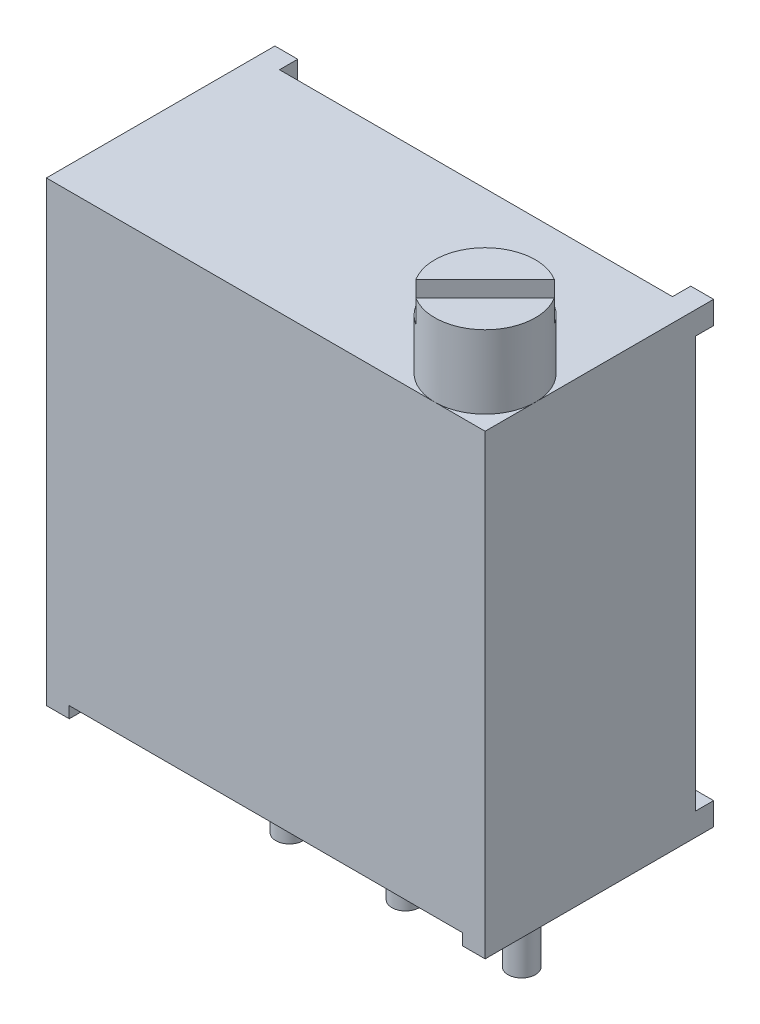
ISO-10303-21;
HEADER;
FILE_DESCRIPTION(('STEP AP214'),'2;1');
FILE_NAME('part.step','',(''),(''),'','','');
FILE_SCHEMA(('AUTOMOTIVE_DESIGN { 1 0 10303 214 1 1 1 1 }'));
ENDSEC;
DATA;
#1=APPLICATION_CONTEXT('core data for automotive mechanical design processes');
#2=APPLICATION_PROTOCOL_DEFINITION('international standard','automotive_design',2000,#1);
#3=PRODUCT_CONTEXT('',#1,'mechanical');
#4=PRODUCT('Part','Part','',(#3));
#5=PRODUCT_RELATED_PRODUCT_CATEGORY('part','',(#4));
#6=PRODUCT_DEFINITION_FORMATION('','',#4);
#7=PRODUCT_DEFINITION_CONTEXT('part definition',#1,'design');
#8=PRODUCT_DEFINITION('design','',#6,#7);
#9=PRODUCT_DEFINITION_SHAPE('','',#8);
#10=(LENGTH_UNIT() NAMED_UNIT(*) SI_UNIT(.MILLI.,.METRE.));
#11=(NAMED_UNIT(*) PLANE_ANGLE_UNIT() SI_UNIT($,.RADIAN.));
#12=(NAMED_UNIT(*) SI_UNIT($,.STERADIAN.) SOLID_ANGLE_UNIT());
#13=UNCERTAINTY_MEASURE_WITH_UNIT(LENGTH_MEASURE(1.E-05),#10,'distance_accuracy_value','');
#14=(GEOMETRIC_REPRESENTATION_CONTEXT(3) GLOBAL_UNCERTAINTY_ASSIGNED_CONTEXT((#13)) GLOBAL_UNIT_ASSIGNED_CONTEXT((#10,
#11,#12)) REPRESENTATION_CONTEXT('',''));
#15=CARTESIAN_POINT('',(0.,0.,0.));
#16=DIRECTION('',(0.,0.,1.));
#17=DIRECTION('',(1.,0.,0.));
#18=AXIS2_PLACEMENT_3D('',#15,#16,#17);
#19=CARTESIAN_POINT('',(1.1,11.6,1.9));
#20=DIRECTION('',(0.,1.,0.));
#21=DIRECTION('',(0.,0.,1.));
#22=AXIS2_PLACEMENT_3D('',#19,#20,#21);
#23=PLANE('',#22);
#24=DIRECTION('',(-0.707106781186547,0.,0.707106781186548));
#25=VECTOR('',#24,1.);
#26=CARTESIAN_POINT('',(0.165760434326207,11.6,2.48068617508052));
#27=LINE('',#26,#25);
#28=CARTESIAN_POINT('',(1.68068617508052,11.6,0.965760434326207));
#29=VERTEX_POINT('',#28);
#30=CARTESIAN_POINT('',(0.165760434326207,11.6,2.48068617508052));
#31=VERTEX_POINT('',#30);
#32=EDGE_CURVE('E89',#29,#31,#27,.T.);
#33=ORIENTED_EDGE('',*,*,#32,.F.);
#34=CARTESIAN_POINT('',(1.1,11.6,1.9));
#35=DIRECTION('',(0.,1.,0.));
#36=DIRECTION('',(0.,0.,1.));
#37=AXIS2_PLACEMENT_3D('',#34,#35,#36);
#38=CIRCLE('',#37,1.1);
#39=EDGE_CURVE('E13',#29,#31,#38,.T.);
#40=ORIENTED_EDGE('',*,*,#39,.T.);
#41=EDGE_LOOP('',(#33,#40));
#42=FACE_BOUND('',#41,.T.);
#43=ADVANCED_FACE('F50',(#42),#23,.T.);
#44=CARTESIAN_POINT('',(1.1,11.6,1.9));
#45=DIRECTION('',(0.,-1.,0.));
#46=DIRECTION('',(0.,0.,-1.));
#47=AXIS2_PLACEMENT_3D('',#44,#45,#46);
#48=CYLINDRICAL_SURFACE('',#47,1.1);
#49=ORIENTED_EDGE('',*,*,#39,.F.);
#50=DIRECTION('',(0.,1.,0.));
#51=VECTOR('',#50,1.);
#52=CARTESIAN_POINT('',(1.68068617508052,11.1,0.965760434326207));
#53=LINE('',#52,#51);
#54=CARTESIAN_POINT('',(1.68068617508052,11.1,0.965760434326207));
#55=VERTEX_POINT('',#54);
#56=EDGE_CURVE('E103',#55,#29,#53,.T.);
#57=ORIENTED_EDGE('',*,*,#56,.F.);
#58=CARTESIAN_POINT('',(1.1,11.1,1.9));
#59=DIRECTION('',(0.,1.,0.));
#60=DIRECTION('',(0.,0.,1.));
#61=AXIS2_PLACEMENT_3D('',#58,#59,#60);
#62=CIRCLE('',#61,1.1);
#63=CARTESIAN_POINT('',(2.03423956567379,11.1,1.31931382491948));
#64=VERTEX_POINT('',#63);
#65=EDGE_CURVE('E107',#64,#55,#62,.T.);
#66=ORIENTED_EDGE('',*,*,#65,.F.);
#67=DIRECTION('',(0.,1.,0.));
#68=VECTOR('',#67,1.);
#69=CARTESIAN_POINT('',(2.03423956567379,11.1,1.31931382491948));
#70=LINE('',#69,#68);
#71=CARTESIAN_POINT('',(2.03423956567379,11.6,1.31931382491948));
#72=VERTEX_POINT('',#71);
#73=EDGE_CURVE('E96',#64,#72,#70,.T.);
#74=ORIENTED_EDGE('',*,*,#73,.T.);
#75=CARTESIAN_POINT('',(0.519313824919481,11.6,2.83423956567379));
#76=VERTEX_POINT('',#75);
#77=EDGE_CURVE('E59',#76,#72,#38,.T.);
#78=ORIENTED_EDGE('',*,*,#77,.F.);
#79=DIRECTION('',(0.,1.,0.));
#80=VECTOR('',#79,1.);
#81=CARTESIAN_POINT('',(0.519313824919481,11.1,2.83423956567379));
#82=LINE('',#81,#80);
#83=CARTESIAN_POINT('',(0.519313824919481,11.1,2.83423956567379));
#84=VERTEX_POINT('',#83);
#85=EDGE_CURVE('E66',#84,#76,#82,.T.);
#86=ORIENTED_EDGE('',*,*,#85,.F.);
#87=CARTESIAN_POINT('',(1.1,11.1,1.9));
#88=DIRECTION('',(0.,1.,0.));
#89=DIRECTION('',(0.,0.,1.));
#90=AXIS2_PLACEMENT_3D('',#87,#88,#89);
#91=CIRCLE('',#90,1.1);
#92=CARTESIAN_POINT('',(0.165760434326207,11.1,2.48068617508052));
#93=VERTEX_POINT('',#92);
#94=EDGE_CURVE('E109',#93,#84,#91,.T.);
#95=ORIENTED_EDGE('',*,*,#94,.F.);
#96=DIRECTION('',(0.,1.,0.));
#97=VECTOR('',#96,1.);
#98=CARTESIAN_POINT('',(0.165760434326207,11.1,2.48068617508052));
#99=LINE('',#98,#97);
#100=EDGE_CURVE('E75',#93,#31,#99,.T.);
#101=ORIENTED_EDGE('',*,*,#100,.T.);
#102=EDGE_LOOP('',(#49,#57,#66,#74,#78,#86,#95,#101));
#103=FACE_BOUND('',#102,.T.);
#104=CARTESIAN_POINT('',(1.1,10.,1.9));
#105=DIRECTION('',(0.,1.,0.));
#106=DIRECTION('',(0.,0.,1.));
#107=AXIS2_PLACEMENT_3D('',#104,#105,#106);
#108=CIRCLE('',#107,1.1);
#109=CARTESIAN_POINT('',(1.1,10.,3.));
#110=VERTEX_POINT('',#109);
#111=EDGE_CURVE('E54',#110,#110,#108,.T.);
#112=ORIENTED_EDGE('',*,*,#111,.T.);
#113=EDGE_LOOP('',(#112));
#114=FACE_BOUND('',#113,.T.);
#115=ADVANCED_FACE('F52',(#103,#114),#48,.T.);
#116=DIRECTION('',(0.707106781186547,0.,-0.707106781186548));
#117=VECTOR('',#116,1.);
#118=CARTESIAN_POINT('',(2.03423956567379,11.6,1.31931382491948));
#119=LINE('',#118,#117);
#120=EDGE_CURVE('E98',#76,#72,#119,.T.);
#121=ORIENTED_EDGE('',*,*,#120,.F.);
#122=ORIENTED_EDGE('',*,*,#77,.T.);
#123=EDGE_LOOP('',(#121,#122));
#124=FACE_BOUND('',#123,.T.);
#125=ADVANCED_FACE('F130',(#124),#23,.T.);
#126=CARTESIAN_POINT('',(1.1,10.,1.9));
#127=DIRECTION('',(0.,1.,0.));
#128=DIRECTION('',(0.,0.,1.));
#129=AXIS2_PLACEMENT_3D('',#126,#127,#128);
#130=PLANE('',#129);
#131=ORIENTED_EDGE('',*,*,#111,.F.);
#132=EDGE_LOOP('',(#131));
#133=FACE_BOUND('',#132,.T.);
#134=ADVANCED_FACE('F127',(#133),#130,.F.);
#135=CARTESIAN_POINT('',(0.165760434326207,11.1,2.48068617508052));
#136=DIRECTION('',(-0.707106781186548,0.,-0.707106781186547));
#137=DIRECTION('',(-0.707106781186547,0.,0.707106781186548));
#138=AXIS2_PLACEMENT_3D('',#135,#136,#137);
#139=PLANE('',#138);
#140=ORIENTED_EDGE('',*,*,#32,.T.);
#141=ORIENTED_EDGE('',*,*,#100,.F.);
#142=DIRECTION('',(-0.707106781186547,0.,0.707106781186548));
#143=VECTOR('',#142,1.);
#144=CARTESIAN_POINT('',(0.165760434326207,11.1,2.48068617508052));
#145=LINE('',#144,#143);
#146=EDGE_CURVE('E114',#55,#93,#145,.T.);
#147=ORIENTED_EDGE('',*,*,#146,.F.);
#148=ORIENTED_EDGE('',*,*,#56,.T.);
#149=EDGE_LOOP('',(#140,#141,#147,#148));
#150=FACE_BOUND('',#149,.T.);
#151=ADVANCED_FACE('F129',(#150),#139,.F.);
#152=CARTESIAN_POINT('',(2.03423956567379,11.1,1.31931382491948));
#153=DIRECTION('',(0.707106781186548,0.,0.707106781186547));
#154=DIRECTION('',(0.707106781186547,0.,-0.707106781186548));
#155=AXIS2_PLACEMENT_3D('',#152,#153,#154);
#156=PLANE('',#155);
#157=ORIENTED_EDGE('',*,*,#120,.T.);
#158=ORIENTED_EDGE('',*,*,#73,.F.);
#159=DIRECTION('',(0.707106781186547,0.,-0.707106781186548));
#160=VECTOR('',#159,1.);
#161=CARTESIAN_POINT('',(2.03423956567379,11.1,1.31931382491948));
#162=LINE('',#161,#160);
#163=EDGE_CURVE('E93',#84,#64,#162,.T.);
#164=ORIENTED_EDGE('',*,*,#163,.F.);
#165=ORIENTED_EDGE('',*,*,#85,.T.);
#166=EDGE_LOOP('',(#157,#158,#164,#165));
#167=FACE_BOUND('',#166,.T.);
#168=ADVANCED_FACE('F97',(#167),#156,.F.);
#169=CARTESIAN_POINT('',(1.1,11.1,1.9));
#170=DIRECTION('',(0.,1.,0.));
#171=DIRECTION('',(0.,0.,1.));
#172=AXIS2_PLACEMENT_3D('',#169,#170,#171);
#173=PLANE('',#172);
#174=ORIENTED_EDGE('',*,*,#94,.T.);
#175=ORIENTED_EDGE('',*,*,#163,.T.);
#176=ORIENTED_EDGE('',*,*,#65,.T.);
#177=ORIENTED_EDGE('',*,*,#146,.T.);
#178=EDGE_LOOP('',(#174,#175,#176,#177));
#179=FACE_BOUND('',#178,.T.);
#180=ADVANCED_FACE('F106',(#179),#173,.T.);
#181=CLOSED_SHELL('',(#43,#115,#125,#134,#151,#168,#180));
#182=MANIFOLD_SOLID_BREP('B2',#181);
#183=CARTESIAN_POINT('',(-6.9,0.25,3.));
#184=DIRECTION('',(0.,1.,0.));
#185=DIRECTION('',(0.,0.,1.));
#186=AXIS2_PLACEMENT_3D('',#183,#184,#185);
#187=PLANE('',#186);
#188=CARTESIAN_POINT('',(-2.54,0.25,0.));
#189=DIRECTION('',(0.,1.,0.));
#190=DIRECTION('',(0.,0.,1.));
#191=AXIS2_PLACEMENT_3D('',#188,#189,#190);
#192=CIRCLE('',#191,0.3);
#193=CARTESIAN_POINT('',(-2.54,0.25,0.3));
#194=VERTEX_POINT('',#193);
#195=EDGE_CURVE('E196',#194,#194,#192,.F.);
#196=ORIENTED_EDGE('',*,*,#195,.F.);
#197=EDGE_LOOP('',(#196));
#198=FACE_BOUND('',#197,.T.);
#199=DIRECTION('',(0.,0.,-1.));
#200=VECTOR('',#199,1.);
#201=CARTESIAN_POINT('',(-6.9,0.25,-1.6));
#202=LINE('',#201,#200);
#203=CARTESIAN_POINT('',(-6.9,0.25,3.));
#204=VERTEX_POINT('',#203);
#205=CARTESIAN_POINT('',(-6.9,0.25,-1.6));
#206=VERTEX_POINT('',#205);
#207=EDGE_CURVE('E322',#204,#206,#202,.T.);
#208=ORIENTED_EDGE('',*,*,#207,.T.);
#209=DIRECTION('',(1.,0.,0.));
#210=VECTOR('',#209,1.);
#211=CARTESIAN_POINT('',(-6.9,0.25,-1.6));
#212=LINE('',#211,#210);
#213=CARTESIAN_POINT('',(1.7,0.25,-1.6));
#214=VERTEX_POINT('',#213);
#215=EDGE_CURVE('E326',#206,#214,#212,.T.);
#216=ORIENTED_EDGE('',*,*,#215,.T.);
#217=DIRECTION('',(0.,0.,1.));
#218=VECTOR('',#217,1.);
#219=CARTESIAN_POINT('',(1.7,0.25,-1.6));
#220=LINE('',#219,#218);
#221=CARTESIAN_POINT('',(1.7,0.25,3.));
#222=VERTEX_POINT('',#221);
#223=EDGE_CURVE('E343',#214,#222,#220,.T.);
#224=ORIENTED_EDGE('',*,*,#223,.T.);
#225=DIRECTION('',(-1.,0.,0.));
#226=VECTOR('',#225,1.);
#227=CARTESIAN_POINT('',(-6.9,0.25,3.));
#228=LINE('',#227,#226);
#229=EDGE_CURVE('E329',#222,#204,#228,.T.);
#230=ORIENTED_EDGE('',*,*,#229,.T.);
#231=EDGE_LOOP('',(#208,#216,#224,#230));
#232=FACE_BOUND('',#231,.T.);
#233=CARTESIAN_POINT('',(0.,0.25,0.));
#234=DIRECTION('',(0.,1.,0.));
#235=DIRECTION('',(0.,0.,1.));
#236=AXIS2_PLACEMENT_3D('',#233,#234,#235);
#237=CIRCLE('',#236,0.3);
#238=CARTESIAN_POINT('',(0.,0.25,0.3));
#239=VERTEX_POINT('',#238);
#240=EDGE_CURVE('E457',#239,#239,#237,.F.);
#241=ORIENTED_EDGE('',*,*,#240,.F.);
#242=EDGE_LOOP('',(#241));
#243=FACE_BOUND('',#242,.T.);
#244=CARTESIAN_POINT('',(-5.08,0.25,0.));
#245=DIRECTION('',(0.,1.,0.));
#246=DIRECTION('',(0.,0.,1.));
#247=AXIS2_PLACEMENT_3D('',#244,#245,#246);
#248=CIRCLE('',#247,0.3);
#249=CARTESIAN_POINT('',(-5.08,0.25,0.299999999999999));
#250=VERTEX_POINT('',#249);
#251=EDGE_CURVE('E48',#250,#250,#248,.F.);
#252=ORIENTED_EDGE('',*,*,#251,.F.);
#253=EDGE_LOOP('',(#252));
#254=FACE_BOUND('',#253,.T.);
#255=ADVANCED_FACE('F187',(#198,#232,#243,#254),#187,.F.);
#256=CARTESIAN_POINT('',(2.2,0.,3.));
#257=DIRECTION('',(0.,-1.,0.));
#258=DIRECTION('',(0.,0.,-1.));
#259=AXIS2_PLACEMENT_3D('',#256,#257,#258);
#260=PLANE('',#259);
#261=DIRECTION('',(0.,0.,-1.));
#262=VECTOR('',#261,1.);
#263=CARTESIAN_POINT('',(-6.9,0.,-1.6));
#264=LINE('',#263,#262);
#265=CARTESIAN_POINT('',(-6.9,0.,3.));
#266=VERTEX_POINT('',#265);
#267=CARTESIAN_POINT('',(-6.9,0.,-2.));
#268=VERTEX_POINT('',#267);
#269=EDGE_CURVE('E364',#266,#268,#264,.T.);
#270=ORIENTED_EDGE('',*,*,#269,.F.);
#271=DIRECTION('',(1.,0.,0.));
#272=VECTOR('',#271,1.);
#273=CARTESIAN_POINT('',(2.2,0.,3.));
#274=LINE('',#273,#272);
#275=CARTESIAN_POINT('',(-7.4,0.,3.));
#276=VERTEX_POINT('',#275);
#277=EDGE_CURVE('E431',#276,#266,#274,.T.);
#278=ORIENTED_EDGE('',*,*,#277,.F.);
#279=DIRECTION('',(0.,0.,1.));
#280=VECTOR('',#279,1.);
#281=CARTESIAN_POINT('',(-7.4,0.,-2.));
#282=LINE('',#281,#280);
#283=CARTESIAN_POINT('',(-7.4,0.,-2.));
#284=VERTEX_POINT('',#283);
#285=EDGE_CURVE('E221',#284,#276,#282,.T.);
#286=ORIENTED_EDGE('',*,*,#285,.F.);
#287=DIRECTION('',(-1.,0.,0.));
#288=VECTOR('',#287,1.);
#289=CARTESIAN_POINT('',(2.2,0.,-2.));
#290=LINE('',#289,#288);
#291=EDGE_CURVE('E439',#268,#284,#290,.T.);
#292=ORIENTED_EDGE('',*,*,#291,.F.);
#293=EDGE_LOOP('',(#270,#278,#286,#292));
#294=FACE_BOUND('',#293,.T.);
#295=ADVANCED_FACE('F465',(#294),#260,.T.);
#296=CARTESIAN_POINT('',(2.2,10.,-2.));
#297=DIRECTION('',(0.,0.,1.));
#298=DIRECTION('',(1.,0.,0.));
#299=AXIS2_PLACEMENT_3D('',#296,#297,#298);
#300=PLANE('',#299);
#301=DIRECTION('',(-1.,0.,0.));
#302=VECTOR('',#301,1.);
#303=CARTESIAN_POINT('',(-7.4,9.5,-2.));
#304=LINE('',#303,#302);
#305=CARTESIAN_POINT('',(-6.9,9.5,-2.));
#306=VERTEX_POINT('',#305);
#307=CARTESIAN_POINT('',(-7.4,9.5,-2.));
#308=VERTEX_POINT('',#307);
#309=EDGE_CURVE('E408',#306,#308,#304,.T.);
#310=ORIENTED_EDGE('',*,*,#309,.T.);
#311=DIRECTION('',(0.,-1.,0.));
#312=VECTOR('',#311,1.);
#313=CARTESIAN_POINT('',(-7.4,10.,-2.));
#314=LINE('',#313,#312);
#315=CARTESIAN_POINT('',(-7.4,10.,-2.));
#316=VERTEX_POINT('',#315);
#317=EDGE_CURVE('E450',#316,#308,#314,.T.);
#318=ORIENTED_EDGE('',*,*,#317,.F.);
#319=DIRECTION('',(-1.,0.,0.));
#320=VECTOR('',#319,1.);
#321=CARTESIAN_POINT('',(2.2,10.,-2.));
#322=LINE('',#321,#320);
#323=CARTESIAN_POINT('',(-6.9,10.,-2.));
#324=VERTEX_POINT('',#323);
#325=EDGE_CURVE('E430',#324,#316,#322,.T.);
#326=ORIENTED_EDGE('',*,*,#325,.F.);
#327=DIRECTION('',(0.,-1.,0.));
#328=VECTOR('',#327,1.);
#329=CARTESIAN_POINT('',(-6.9,10.,-2.));
#330=LINE('',#329,#328);
#331=EDGE_CURVE('E399',#324,#306,#330,.T.);
#332=ORIENTED_EDGE('',*,*,#331,.T.);
#333=EDGE_LOOP('',(#310,#318,#326,#332));
#334=FACE_BOUND('',#333,.T.);
#335=ADVANCED_FACE('F470',(#334),#300,.F.);
#336=DIRECTION('',(0.,1.,0.));
#337=VECTOR('',#336,1.);
#338=CARTESIAN_POINT('',(1.7,10.,-2.));
#339=LINE('',#338,#337);
#340=CARTESIAN_POINT('',(1.7,9.5,-2.));
#341=VERTEX_POINT('',#340);
#342=CARTESIAN_POINT('',(1.7,10.,-2.));
#343=VERTEX_POINT('',#342);
#344=EDGE_CURVE('E389',#341,#343,#339,.T.);
#345=ORIENTED_EDGE('',*,*,#344,.T.);
#346=CARTESIAN_POINT('',(2.2,10.,-2.));
#347=VERTEX_POINT('',#346);
#348=EDGE_CURVE('E432',#347,#343,#322,.T.);
#349=ORIENTED_EDGE('',*,*,#348,.F.);
#350=DIRECTION('',(0.,-1.,0.));
#351=VECTOR('',#350,1.);
#352=CARTESIAN_POINT('',(2.2,10.,-2.));
#353=LINE('',#352,#351);
#354=CARTESIAN_POINT('',(2.2,9.5,-2.));
#355=VERTEX_POINT('',#354);
#356=EDGE_CURVE('E454',#347,#355,#353,.T.);
#357=ORIENTED_EDGE('',*,*,#356,.T.);
#358=DIRECTION('',(-1.,0.,0.));
#359=VECTOR('',#358,1.);
#360=CARTESIAN_POINT('',(2.2,9.5,-2.));
#361=LINE('',#360,#359);
#362=EDGE_CURVE('E380',#355,#341,#361,.T.);
#363=ORIENTED_EDGE('',*,*,#362,.T.);
#364=EDGE_LOOP('',(#345,#349,#357,#363));
#365=FACE_BOUND('',#364,.T.);
#366=ADVANCED_FACE('F522',(#365),#300,.F.);
#367=DIRECTION('',(1.,0.,0.));
#368=VECTOR('',#367,1.);
#369=CARTESIAN_POINT('',(2.2,0.499999999999999,-2.));
#370=LINE('',#369,#368);
#371=CARTESIAN_POINT('',(1.7,0.499999999999999,-2.));
#372=VERTEX_POINT('',#371);
#373=CARTESIAN_POINT('',(2.2,0.499999999999999,-2.));
#374=VERTEX_POINT('',#373);
#375=EDGE_CURVE('E370',#372,#374,#370,.T.);
#376=ORIENTED_EDGE('',*,*,#375,.T.);
#377=CARTESIAN_POINT('',(2.2,0.,-2.));
#378=VERTEX_POINT('',#377);
#379=EDGE_CURVE('E453',#374,#378,#353,.T.);
#380=ORIENTED_EDGE('',*,*,#379,.T.);
#381=CARTESIAN_POINT('',(1.7,0.,-2.));
#382=VERTEX_POINT('',#381);
#383=EDGE_CURVE('E440',#378,#382,#290,.T.);
#384=ORIENTED_EDGE('',*,*,#383,.T.);
#385=DIRECTION('',(0.,1.,0.));
#386=VECTOR('',#385,1.);
#387=CARTESIAN_POINT('',(1.7,0.,-2.));
#388=LINE('',#387,#386);
#389=EDGE_CURVE('E366',#382,#372,#388,.T.);
#390=ORIENTED_EDGE('',*,*,#389,.T.);
#391=EDGE_LOOP('',(#376,#380,#384,#390));
#392=FACE_BOUND('',#391,.T.);
#393=ADVANCED_FACE('F527',(#392),#300,.F.);
#394=DIRECTION('',(0.,-1.,0.));
#395=VECTOR('',#394,1.);
#396=CARTESIAN_POINT('',(-6.9,0.,-2.));
#397=LINE('',#396,#395);
#398=CARTESIAN_POINT('',(-6.9,0.499999999999999,-2.));
#399=VERTEX_POINT('',#398);
#400=EDGE_CURVE('E354',#399,#268,#397,.T.);
#401=ORIENTED_EDGE('',*,*,#400,.T.);
#402=ORIENTED_EDGE('',*,*,#291,.T.);
#403=CARTESIAN_POINT('',(-7.4,0.499999999999999,-2.));
#404=VERTEX_POINT('',#403);
#405=EDGE_CURVE('E449',#404,#284,#314,.T.);
#406=ORIENTED_EDGE('',*,*,#405,.F.);
#407=DIRECTION('',(1.,0.,0.));
#408=VECTOR('',#407,1.);
#409=CARTESIAN_POINT('',(-7.4,0.499999999999999,-2.));
#410=LINE('',#409,#408);
#411=EDGE_CURVE('E358',#404,#399,#410,.T.);
#412=ORIENTED_EDGE('',*,*,#411,.T.);
#413=EDGE_LOOP('',(#401,#402,#406,#412));
#414=FACE_BOUND('',#413,.T.);
#415=ADVANCED_FACE('F520',(#414),#300,.F.);
#416=CARTESIAN_POINT('',(-7.4,10.,-2.));
#417=DIRECTION('',(1.,0.,0.));
#418=DIRECTION('',(0.,0.,-1.));
#419=AXIS2_PLACEMENT_3D('',#416,#417,#418);
#420=PLANE('',#419);
#421=DIRECTION('',(0.,0.,-1.));
#422=VECTOR('',#421,1.);
#423=CARTESIAN_POINT('',(-7.4,9.5,-1.6));
#424=LINE('',#423,#422);
#425=CARTESIAN_POINT('',(-7.4,9.5,-1.6));
#426=VERTEX_POINT('',#425);
#427=EDGE_CURVE('E416',#426,#308,#424,.T.);
#428=ORIENTED_EDGE('',*,*,#427,.F.);
#429=DIRECTION('',(0.,1.,0.));
#430=VECTOR('',#429,1.);
#431=CARTESIAN_POINT('',(-7.4,10.,-1.6));
#432=LINE('',#431,#430);
#433=CARTESIAN_POINT('',(-7.4,0.499999999999999,-1.6));
#434=VERTEX_POINT('',#433);
#435=EDGE_CURVE('E424',#434,#426,#432,.T.);
#436=ORIENTED_EDGE('',*,*,#435,.F.);
#437=DIRECTION('',(0.,0.,-1.));
#438=VECTOR('',#437,1.);
#439=CARTESIAN_POINT('',(-7.4,0.499999999999999,-1.6));
#440=LINE('',#439,#438);
#441=EDGE_CURVE('E349',#434,#404,#440,.T.);
#442=ORIENTED_EDGE('',*,*,#441,.T.);
#443=ORIENTED_EDGE('',*,*,#405,.T.);
#444=ORIENTED_EDGE('',*,*,#285,.T.);
#445=DIRECTION('',(0.,-1.,0.));
#446=VECTOR('',#445,1.);
#447=CARTESIAN_POINT('',(-7.4,10.,3.));
#448=LINE('',#447,#446);
#449=CARTESIAN_POINT('',(-7.4,10.,3.));
#450=VERTEX_POINT('',#449);
#451=EDGE_CURVE('E447',#450,#276,#448,.T.);
#452=ORIENTED_EDGE('',*,*,#451,.F.);
#453=DIRECTION('',(0.,0.,1.));
#454=VECTOR('',#453,1.);
#455=CARTESIAN_POINT('',(-7.4,10.,-2.));
#456=LINE('',#455,#454);
#457=EDGE_CURVE('E434',#316,#450,#456,.T.);
#458=ORIENTED_EDGE('',*,*,#457,.F.);
#459=ORIENTED_EDGE('',*,*,#317,.T.);
#460=EDGE_LOOP('',(#428,#436,#442,#443,#444,#452,#458,#459));
#461=FACE_BOUND('',#460,.T.);
#462=ADVANCED_FACE('F515',(#461),#420,.F.);
#463=CARTESIAN_POINT('',(1.7,0.,3.));
#464=VERTEX_POINT('',#463);
#465=CARTESIAN_POINT('',(2.2,0.,3.));
#466=VERTEX_POINT('',#465);
#467=EDGE_CURVE('E228',#464,#466,#274,.T.);
#468=ORIENTED_EDGE('',*,*,#467,.F.);
#469=DIRECTION('',(0.,0.,-1.));
#470=VECTOR('',#469,1.);
#471=CARTESIAN_POINT('',(1.7,0.,-1.6));
#472=LINE('',#471,#470);
#473=EDGE_CURVE('E373',#464,#382,#472,.T.);
#474=ORIENTED_EDGE('',*,*,#473,.T.);
#475=ORIENTED_EDGE('',*,*,#383,.F.);
#476=DIRECTION('',(0.,0.,-1.));
#477=VECTOR('',#476,1.);
#478=CARTESIAN_POINT('',(2.2,0.,-2.));
#479=LINE('',#478,#477);
#480=EDGE_CURVE('E428',#466,#378,#479,.T.);
#481=ORIENTED_EDGE('',*,*,#480,.F.);
#482=EDGE_LOOP('',(#468,#474,#475,#481));
#483=FACE_BOUND('',#482,.T.);
#484=ADVANCED_FACE('F473',(#483),#260,.T.);
#485=CARTESIAN_POINT('',(2.2,10.,-2.));
#486=DIRECTION('',(-1.,0.,0.));
#487=DIRECTION('',(0.,0.,1.));
#488=AXIS2_PLACEMENT_3D('',#485,#486,#487);
#489=PLANE('',#488);
#490=DIRECTION('',(0.,0.,-1.));
#491=VECTOR('',#490,1.);
#492=CARTESIAN_POINT('',(2.2,0.499999999999999,-1.6));
#493=LINE('',#492,#491);
#494=CARTESIAN_POINT('',(2.2,0.499999999999999,-1.6));
#495=VERTEX_POINT('',#494);
#496=EDGE_CURVE('E378',#495,#374,#493,.T.);
#497=ORIENTED_EDGE('',*,*,#496,.F.);
#498=DIRECTION('',(0.,-1.,0.));
#499=VECTOR('',#498,1.);
#500=CARTESIAN_POINT('',(2.2,10.,-1.6));
#501=LINE('',#500,#499);
#502=CARTESIAN_POINT('',(2.2,9.5,-1.6));
#503=VERTEX_POINT('',#502);
#504=EDGE_CURVE('E426',#503,#495,#501,.T.);
#505=ORIENTED_EDGE('',*,*,#504,.F.);
#506=DIRECTION('',(0.,0.,-1.));
#507=VECTOR('',#506,1.);
#508=CARTESIAN_POINT('',(2.2,9.5,-1.6));
#509=LINE('',#508,#507);
#510=EDGE_CURVE('E392',#503,#355,#509,.T.);
#511=ORIENTED_EDGE('',*,*,#510,.T.);
#512=ORIENTED_EDGE('',*,*,#356,.F.);
#513=DIRECTION('',(0.,0.,-1.));
#514=VECTOR('',#513,1.);
#515=CARTESIAN_POINT('',(2.2,10.,-2.));
#516=LINE('',#515,#514);
#517=CARTESIAN_POINT('',(2.2,10.,3.));
#518=VERTEX_POINT('',#517);
#519=EDGE_CURVE('E233',#518,#347,#516,.T.);
#520=ORIENTED_EDGE('',*,*,#519,.F.);
#521=DIRECTION('',(0.,-1.,0.));
#522=VECTOR('',#521,1.);
#523=CARTESIAN_POINT('',(2.2,10.,3.));
#524=LINE('',#523,#522);
#525=EDGE_CURVE('E437',#518,#466,#524,.T.);
#526=ORIENTED_EDGE('',*,*,#525,.T.);
#527=ORIENTED_EDGE('',*,*,#480,.T.);
#528=ORIENTED_EDGE('',*,*,#379,.F.);
#529=EDGE_LOOP('',(#497,#505,#511,#512,#520,#526,#527,#528));
#530=FACE_BOUND('',#529,.T.);
#531=ADVANCED_FACE('F189',(#530),#489,.F.);
#532=CARTESIAN_POINT('',(2.2,10.,3.));
#533=DIRECTION('',(0.,0.,-1.));
#534=DIRECTION('',(-1.,0.,0.));
#535=AXIS2_PLACEMENT_3D('',#532,#533,#534);
#536=PLANE('',#535);
#537=ORIENTED_EDGE('',*,*,#277,.T.);
#538=DIRECTION('',(0.,-1.,0.));
#539=VECTOR('',#538,1.);
#540=CARTESIAN_POINT('',(-6.9,0.25,3.));
#541=LINE('',#540,#539);
#542=EDGE_CURVE('E361',#204,#266,#541,.T.);
#543=ORIENTED_EDGE('',*,*,#542,.F.);
#544=ORIENTED_EDGE('',*,*,#229,.F.);
#545=DIRECTION('',(0.,-1.,0.));
#546=VECTOR('',#545,1.);
#547=CARTESIAN_POINT('',(1.7,0.25,3.));
#548=LINE('',#547,#546);
#549=EDGE_CURVE('E562',#222,#464,#548,.T.);
#550=ORIENTED_EDGE('',*,*,#549,.T.);
#551=ORIENTED_EDGE('',*,*,#467,.T.);
#552=ORIENTED_EDGE('',*,*,#525,.F.);
#553=DIRECTION('',(1.,0.,0.));
#554=VECTOR('',#553,1.);
#555=CARTESIAN_POINT('',(2.2,10.,3.));
#556=LINE('',#555,#554);
#557=EDGE_CURVE('E204',#450,#518,#556,.T.);
#558=ORIENTED_EDGE('',*,*,#557,.F.);
#559=ORIENTED_EDGE('',*,*,#451,.T.);
#560=EDGE_LOOP('',(#537,#543,#544,#550,#551,#552,#558,#559));
#561=FACE_BOUND('',#560,.T.);
#562=ADVANCED_FACE('F512',(#561),#536,.F.);
#563=CARTESIAN_POINT('',(2.2,10.,3.));
#564=DIRECTION('',(0.,-1.,0.));
#565=DIRECTION('',(0.,0.,-1.));
#566=AXIS2_PLACEMENT_3D('',#563,#564,#565);
#567=PLANE('',#566);
#568=DIRECTION('',(0.,0.,-1.));
#569=VECTOR('',#568,1.);
#570=CARTESIAN_POINT('',(1.7,10.,-1.6));
#571=LINE('',#570,#569);
#572=CARTESIAN_POINT('',(1.7,10.,-1.6));
#573=VERTEX_POINT('',#572);
#574=EDGE_CURVE('E397',#573,#343,#571,.T.);
#575=ORIENTED_EDGE('',*,*,#574,.F.);
#576=DIRECTION('',(1.,0.,0.));
#577=VECTOR('',#576,1.);
#578=CARTESIAN_POINT('',(2.2,10.,-1.6));
#579=LINE('',#578,#577);
#580=CARTESIAN_POINT('',(-6.9,10.,-1.6));
#581=VERTEX_POINT('',#580);
#582=EDGE_CURVE('E418',#581,#573,#579,.T.);
#583=ORIENTED_EDGE('',*,*,#582,.F.);
#584=DIRECTION('',(0.,0.,-1.));
#585=VECTOR('',#584,1.);
#586=CARTESIAN_POINT('',(-6.9,10.,-1.6));
#587=LINE('',#586,#585);
#588=EDGE_CURVE('E411',#581,#324,#587,.T.);
#589=ORIENTED_EDGE('',*,*,#588,.T.);
#590=ORIENTED_EDGE('',*,*,#325,.T.);
#591=ORIENTED_EDGE('',*,*,#457,.T.);
#592=ORIENTED_EDGE('',*,*,#557,.T.);
#593=ORIENTED_EDGE('',*,*,#519,.T.);
#594=ORIENTED_EDGE('',*,*,#348,.T.);
#595=EDGE_LOOP('',(#575,#583,#589,#590,#591,#592,#593,#594));
#596=FACE_BOUND('',#595,.T.);
#597=ADVANCED_FACE('F510',(#596),#567,.F.);
#598=CARTESIAN_POINT('',(-2.6,5.,-1.6));
#599=DIRECTION('',(0.,0.,-1.));
#600=DIRECTION('',(-1.,0.,0.));
#601=AXIS2_PLACEMENT_3D('',#598,#599,#600);
#602=PLANE('',#601);
#603=ORIENTED_EDGE('',*,*,#215,.F.);
#604=DIRECTION('',(0.,-1.,0.));
#605=VECTOR('',#604,1.);
#606=CARTESIAN_POINT('',(-6.9,0.,-1.6));
#607=LINE('',#606,#605);
#608=CARTESIAN_POINT('',(-6.9,0.499999999999999,-1.6));
#609=VERTEX_POINT('',#608);
#610=EDGE_CURVE('E339',#609,#206,#607,.T.);
#611=ORIENTED_EDGE('',*,*,#610,.F.);
#612=DIRECTION('',(1.,0.,0.));
#613=VECTOR('',#612,1.);
#614=CARTESIAN_POINT('',(-7.4,0.499999999999999,-1.6));
#615=LINE('',#614,#613);
#616=EDGE_CURVE('E350',#434,#609,#615,.T.);
#617=ORIENTED_EDGE('',*,*,#616,.F.);
#618=ORIENTED_EDGE('',*,*,#435,.T.);
#619=DIRECTION('',(-1.,0.,0.));
#620=VECTOR('',#619,1.);
#621=CARTESIAN_POINT('',(-7.4,9.5,-1.6));
#622=LINE('',#621,#620);
#623=CARTESIAN_POINT('',(-6.9,9.5,-1.6));
#624=VERTEX_POINT('',#623);
#625=EDGE_CURVE('E407',#624,#426,#622,.T.);
#626=ORIENTED_EDGE('',*,*,#625,.F.);
#627=DIRECTION('',(0.,-1.,0.));
#628=VECTOR('',#627,1.);
#629=CARTESIAN_POINT('',(-6.9,10.,-1.6));
#630=LINE('',#629,#628);
#631=EDGE_CURVE('E404',#581,#624,#630,.T.);
#632=ORIENTED_EDGE('',*,*,#631,.F.);
#633=ORIENTED_EDGE('',*,*,#582,.T.);
#634=DIRECTION('',(0.,1.,0.));
#635=VECTOR('',#634,1.);
#636=CARTESIAN_POINT('',(1.7,10.,-1.6));
#637=LINE('',#636,#635);
#638=CARTESIAN_POINT('',(1.7,9.5,-1.6));
#639=VERTEX_POINT('',#638);
#640=EDGE_CURVE('E388',#639,#573,#637,.T.);
#641=ORIENTED_EDGE('',*,*,#640,.F.);
#642=DIRECTION('',(-1.,0.,0.));
#643=VECTOR('',#642,1.);
#644=CARTESIAN_POINT('',(2.2,9.5,-1.6));
#645=LINE('',#644,#643);
#646=EDGE_CURVE('E385',#503,#639,#645,.T.);
#647=ORIENTED_EDGE('',*,*,#646,.F.);
#648=ORIENTED_EDGE('',*,*,#504,.T.);
#649=DIRECTION('',(1.,0.,0.));
#650=VECTOR('',#649,1.);
#651=CARTESIAN_POINT('',(2.2,0.499999999999999,-1.6));
#652=LINE('',#651,#650);
#653=CARTESIAN_POINT('',(1.7,0.499999999999999,-1.6));
#654=VERTEX_POINT('',#653);
#655=EDGE_CURVE('E369',#654,#495,#652,.T.);
#656=ORIENTED_EDGE('',*,*,#655,.F.);
#657=DIRECTION('',(0.,1.,0.));
#658=VECTOR('',#657,1.);
#659=CARTESIAN_POINT('',(1.7,0.,-1.6));
#660=LINE('',#659,#658);
#661=EDGE_CURVE('E342',#214,#654,#660,.T.);
#662=ORIENTED_EDGE('',*,*,#661,.F.);
#663=EDGE_LOOP('',(#603,#611,#617,#618,#626,#632,#633,#641,#647,#648,#656,#662));
#664=FACE_BOUND('',#663,.T.);
#665=ADVANCED_FACE('F337',(#664),#602,.T.);
#666=CARTESIAN_POINT('',(-7.4,9.5,-1.6));
#667=DIRECTION('',(0.,-1.,0.));
#668=DIRECTION('',(1.,0.,0.));
#669=AXIS2_PLACEMENT_3D('',#666,#667,#668);
#670=PLANE('',#669);
#671=ORIENTED_EDGE('',*,*,#309,.F.);
#672=DIRECTION('',(0.,0.,-1.));
#673=VECTOR('',#672,1.);
#674=CARTESIAN_POINT('',(-6.9,9.5,-1.6));
#675=LINE('',#674,#673);
#676=EDGE_CURVE('E419',#624,#306,#675,.T.);
#677=ORIENTED_EDGE('',*,*,#676,.F.);
#678=ORIENTED_EDGE('',*,*,#625,.T.);
#679=ORIENTED_EDGE('',*,*,#427,.T.);
#680=EDGE_LOOP('',(#671,#677,#678,#679));
#681=FACE_BOUND('',#680,.T.);
#682=ADVANCED_FACE('F501',(#681),#670,.T.);
#683=CARTESIAN_POINT('',(-6.9,10.,-1.6));
#684=DIRECTION('',(1.,0.,0.));
#685=DIRECTION('',(0.,1.,0.));
#686=AXIS2_PLACEMENT_3D('',#683,#684,#685);
#687=PLANE('',#686);
#688=ORIENTED_EDGE('',*,*,#331,.F.);
#689=ORIENTED_EDGE('',*,*,#588,.F.);
#690=ORIENTED_EDGE('',*,*,#631,.T.);
#691=ORIENTED_EDGE('',*,*,#676,.T.);
#692=EDGE_LOOP('',(#688,#689,#690,#691));
#693=FACE_BOUND('',#692,.T.);
#694=ADVANCED_FACE('F496',(#693),#687,.T.);
#695=CARTESIAN_POINT('',(1.7,10.,-1.6));
#696=DIRECTION('',(-1.,0.,0.));
#697=DIRECTION('',(0.,0.,1.));
#698=AXIS2_PLACEMENT_3D('',#695,#696,#697);
#699=PLANE('',#698);
#700=ORIENTED_EDGE('',*,*,#344,.F.);
#701=DIRECTION('',(0.,0.,-1.));
#702=VECTOR('',#701,1.);
#703=CARTESIAN_POINT('',(1.7,9.5,-1.6));
#704=LINE('',#703,#702);
#705=EDGE_CURVE('E400',#639,#341,#704,.T.);
#706=ORIENTED_EDGE('',*,*,#705,.F.);
#707=ORIENTED_EDGE('',*,*,#640,.T.);
#708=ORIENTED_EDGE('',*,*,#574,.T.);
#709=EDGE_LOOP('',(#700,#706,#707,#708));
#710=FACE_BOUND('',#709,.T.);
#711=ADVANCED_FACE('F493',(#710),#699,.T.);
#712=CARTESIAN_POINT('',(2.2,9.5,-1.6));
#713=DIRECTION('',(0.,-1.,0.));
#714=DIRECTION('',(0.,0.,-1.));
#715=AXIS2_PLACEMENT_3D('',#712,#713,#714);
#716=PLANE('',#715);
#717=ORIENTED_EDGE('',*,*,#362,.F.);
#718=ORIENTED_EDGE('',*,*,#510,.F.);
#719=ORIENTED_EDGE('',*,*,#646,.T.);
#720=ORIENTED_EDGE('',*,*,#705,.T.);
#721=EDGE_LOOP('',(#717,#718,#719,#720));
#722=FACE_BOUND('',#721,.T.);
#723=ADVANCED_FACE('F488',(#722),#716,.T.);
#724=CARTESIAN_POINT('',(2.2,0.499999999999999,-1.6));
#725=DIRECTION('',(0.,1.,0.));
#726=DIRECTION('',(0.,0.,1.));
#727=AXIS2_PLACEMENT_3D('',#724,#725,#726);
#728=PLANE('',#727);
#729=ORIENTED_EDGE('',*,*,#375,.F.);
#730=DIRECTION('',(0.,0.,-1.));
#731=VECTOR('',#730,1.);
#732=CARTESIAN_POINT('',(1.7,0.499999999999999,-1.6));
#733=LINE('',#732,#731);
#734=EDGE_CURVE('E381',#654,#372,#733,.T.);
#735=ORIENTED_EDGE('',*,*,#734,.F.);
#736=ORIENTED_EDGE('',*,*,#655,.T.);
#737=ORIENTED_EDGE('',*,*,#496,.T.);
#738=EDGE_LOOP('',(#729,#735,#736,#737));
#739=FACE_BOUND('',#738,.T.);
#740=ADVANCED_FACE('F485',(#739),#728,.T.);
#741=CARTESIAN_POINT('',(1.7,0.,-1.6));
#742=DIRECTION('',(-1.,0.,0.));
#743=DIRECTION('',(0.,0.,1.));
#744=AXIS2_PLACEMENT_3D('',#741,#742,#743);
#745=PLANE('',#744);
#746=ORIENTED_EDGE('',*,*,#389,.F.);
#747=ORIENTED_EDGE('',*,*,#473,.F.);
#748=ORIENTED_EDGE('',*,*,#549,.F.);
#749=ORIENTED_EDGE('',*,*,#223,.F.);
#750=ORIENTED_EDGE('',*,*,#661,.T.);
#751=ORIENTED_EDGE('',*,*,#734,.T.);
#752=EDGE_LOOP('',(#746,#747,#748,#749,#750,#751));
#753=FACE_BOUND('',#752,.T.);
#754=ADVANCED_FACE('F481',(#753),#745,.T.);
#755=CARTESIAN_POINT('',(-6.9,0.,-1.6));
#756=DIRECTION('',(1.,0.,0.));
#757=DIRECTION('',(0.,0.,-1.));
#758=AXIS2_PLACEMENT_3D('',#755,#756,#757);
#759=PLANE('',#758);
#760=ORIENTED_EDGE('',*,*,#400,.F.);
#761=DIRECTION('',(0.,0.,-1.));
#762=VECTOR('',#761,1.);
#763=CARTESIAN_POINT('',(-6.9,0.499999999999999,-1.6));
#764=LINE('',#763,#762);
#765=EDGE_CURVE('E347',#609,#399,#764,.T.);
#766=ORIENTED_EDGE('',*,*,#765,.F.);
#767=ORIENTED_EDGE('',*,*,#610,.T.);
#768=ORIENTED_EDGE('',*,*,#207,.F.);
#769=ORIENTED_EDGE('',*,*,#542,.T.);
#770=ORIENTED_EDGE('',*,*,#269,.T.);
#771=EDGE_LOOP('',(#760,#766,#767,#768,#769,#770));
#772=FACE_BOUND('',#771,.T.);
#773=ADVANCED_FACE('F346',(#772),#759,.T.);
#774=CARTESIAN_POINT('',(-7.4,0.499999999999999,-1.6));
#775=DIRECTION('',(0.,1.,0.));
#776=DIRECTION('',(-1.,0.,0.));
#777=AXIS2_PLACEMENT_3D('',#774,#775,#776);
#778=PLANE('',#777);
#779=ORIENTED_EDGE('',*,*,#411,.F.);
#780=ORIENTED_EDGE('',*,*,#441,.F.);
#781=ORIENTED_EDGE('',*,*,#616,.T.);
#782=ORIENTED_EDGE('',*,*,#765,.T.);
#783=EDGE_LOOP('',(#779,#780,#781,#782));
#784=FACE_BOUND('',#783,.T.);
#785=ADVANCED_FACE('F480',(#784),#778,.T.);
#786=CARTESIAN_POINT('',(0.,-2.75,0.));
#787=DIRECTION('',(0.,1.,0.));
#788=DIRECTION('',(0.,0.,1.));
#789=AXIS2_PLACEMENT_3D('',#786,#787,#788);
#790=CYLINDRICAL_SURFACE('',#789,0.3);
#791=CARTESIAN_POINT('',(0.,-2.75,0.));
#792=DIRECTION('',(0.,-1.,0.));
#793=DIRECTION('',(0.,0.,-1.));
#794=AXIS2_PLACEMENT_3D('',#791,#792,#793);
#795=CIRCLE('',#794,0.3);
#796=CARTESIAN_POINT('',(0.,-2.75,-0.3));
#797=VERTEX_POINT('',#796);
#798=EDGE_CURVE('E334',#797,#797,#795,.T.);
#799=ORIENTED_EDGE('',*,*,#798,.F.);
#800=EDGE_LOOP('',(#799));
#801=FACE_BOUND('',#800,.T.);
#802=ORIENTED_EDGE('',*,*,#240,.T.);
#803=EDGE_LOOP('',(#802));
#804=FACE_BOUND('',#803,.T.);
#805=ADVANCED_FACE('F476',(#801,#804),#790,.T.);
#806=CARTESIAN_POINT('',(0.,-2.75,0.));
#807=DIRECTION('',(0.,-1.,0.));
#808=DIRECTION('',(0.,0.,-1.));
#809=AXIS2_PLACEMENT_3D('',#806,#807,#808);
#810=PLANE('',#809);
#811=ORIENTED_EDGE('',*,*,#798,.T.);
#812=EDGE_LOOP('',(#811));
#813=FACE_BOUND('',#812,.T.);
#814=ADVANCED_FACE('F594',(#813),#810,.T.);
#815=CARTESIAN_POINT('',(-2.54,-2.75,0.));
#816=DIRECTION('',(0.,1.,0.));
#817=DIRECTION('',(0.,0.,1.));
#818=AXIS2_PLACEMENT_3D('',#815,#816,#817);
#819=CYLINDRICAL_SURFACE('',#818,0.3);
#820=CARTESIAN_POINT('',(-2.54,-2.75,0.));
#821=DIRECTION('',(0.,-1.,0.));
#822=DIRECTION('',(0.,0.,-1.));
#823=AXIS2_PLACEMENT_3D('',#820,#821,#822);
#824=CIRCLE('',#823,0.3);
#825=CARTESIAN_POINT('',(-2.54,-2.75,-0.3));
#826=VERTEX_POINT('',#825);
#827=EDGE_CURVE('E569',#826,#826,#824,.T.);
#828=ORIENTED_EDGE('',*,*,#827,.F.);
#829=EDGE_LOOP('',(#828));
#830=FACE_BOUND('',#829,.T.);
#831=ORIENTED_EDGE('',*,*,#195,.T.);
#832=EDGE_LOOP('',(#831));
#833=FACE_BOUND('',#832,.T.);
#834=ADVANCED_FACE('F462',(#830,#833),#819,.T.);
#835=CARTESIAN_POINT('',(-2.54,-2.75,0.));
#836=DIRECTION('',(0.,-1.,0.));
#837=DIRECTION('',(0.,0.,-1.));
#838=AXIS2_PLACEMENT_3D('',#835,#836,#837);
#839=PLANE('',#838);
#840=ORIENTED_EDGE('',*,*,#827,.T.);
#841=EDGE_LOOP('',(#840));
#842=FACE_BOUND('',#841,.T.);
#843=ADVANCED_FACE('F581',(#842),#839,.T.);
#844=CARTESIAN_POINT('',(-5.08,-2.75,0.));
#845=DIRECTION('',(0.,1.,0.));
#846=DIRECTION('',(0.,0.,1.));
#847=AXIS2_PLACEMENT_3D('',#844,#845,#846);
#848=CYLINDRICAL_SURFACE('',#847,0.3);
#849=CARTESIAN_POINT('',(-5.08,-2.75,0.));
#850=DIRECTION('',(0.,-1.,0.));
#851=DIRECTION('',(0.,0.,-1.));
#852=AXIS2_PLACEMENT_3D('',#849,#850,#851);
#853=CIRCLE('',#852,0.3);
#854=CARTESIAN_POINT('',(-5.08,-2.75,-0.300000000000001));
#855=VERTEX_POINT('',#854);
#856=EDGE_CURVE('E572',#855,#855,#853,.T.);
#857=ORIENTED_EDGE('',*,*,#856,.F.);
#858=EDGE_LOOP('',(#857));
#859=FACE_BOUND('',#858,.T.);
#860=ORIENTED_EDGE('',*,*,#251,.T.);
#861=EDGE_LOOP('',(#860));
#862=FACE_BOUND('',#861,.T.);
#863=ADVANCED_FACE('F578',(#859,#862),#848,.T.);
#864=CARTESIAN_POINT('',(-5.08,-2.75,0.));
#865=DIRECTION('',(0.,-1.,0.));
#866=DIRECTION('',(0.,0.,-1.));
#867=AXIS2_PLACEMENT_3D('',#864,#865,#866);
#868=PLANE('',#867);
#869=ORIENTED_EDGE('',*,*,#856,.T.);
#870=EDGE_LOOP('',(#869));
#871=FACE_BOUND('',#870,.T.);
#872=ADVANCED_FACE('F576',(#871),#868,.T.);
#873=CLOSED_SHELL('',(#255,#295,#335,#366,#393,#415,#462,#484,#531,#562,#597,#665,#682,#694,
#711,#723,#740,#754,#773,#785,#805,#814,#834,#843,#863,#872));
#874=MANIFOLD_SOLID_BREP('B7',#873);
#875=ADVANCED_BREP_SHAPE_REPRESENTATION('',(#18,#182,#874),#14);
#876=SHAPE_DEFINITION_REPRESENTATION(#9,#875);
ENDSEC;
END-ISO-10303-21;
